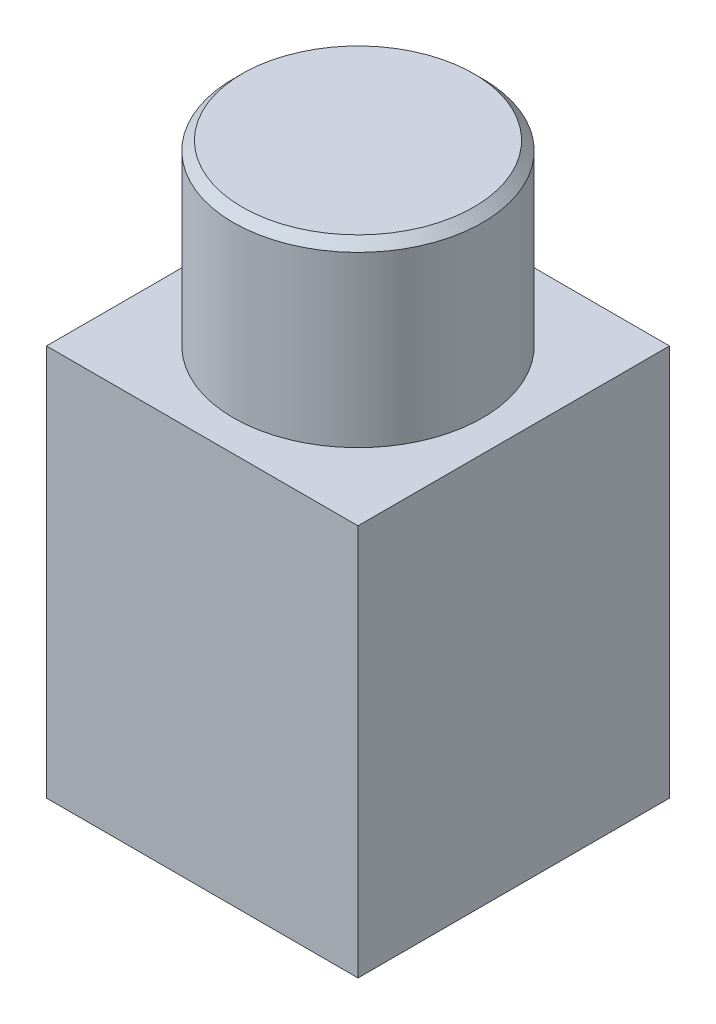
ISO-10303-21;
HEADER;
FILE_DESCRIPTION(('STEP AP214'),'2;1');
FILE_NAME('part.step','',(''),(''),'','','');
FILE_SCHEMA(('AUTOMOTIVE_DESIGN { 1 0 10303 214 1 1 1 1 }'));
ENDSEC;
DATA;
#1=APPLICATION_CONTEXT('core data for automotive mechanical design processes');
#2=APPLICATION_PROTOCOL_DEFINITION('international standard','automotive_design',2000,#1);
#3=PRODUCT_CONTEXT('',#1,'mechanical');
#4=PRODUCT('Part','Part','',(#3));
#5=PRODUCT_RELATED_PRODUCT_CATEGORY('part','',(#4));
#6=PRODUCT_DEFINITION_FORMATION('','',#4);
#7=PRODUCT_DEFINITION_CONTEXT('part definition',#1,'design');
#8=PRODUCT_DEFINITION('design','',#6,#7);
#9=PRODUCT_DEFINITION_SHAPE('','',#8);
#10=(LENGTH_UNIT() NAMED_UNIT(*) SI_UNIT(.MILLI.,.METRE.));
#11=(NAMED_UNIT(*) PLANE_ANGLE_UNIT() SI_UNIT($,.RADIAN.));
#12=(NAMED_UNIT(*) SI_UNIT($,.STERADIAN.) SOLID_ANGLE_UNIT());
#13=UNCERTAINTY_MEASURE_WITH_UNIT(LENGTH_MEASURE(1.E-05),#10,'distance_accuracy_value','');
#14=(GEOMETRIC_REPRESENTATION_CONTEXT(3) GLOBAL_UNCERTAINTY_ASSIGNED_CONTEXT((#13)) GLOBAL_UNIT_ASSIGNED_CONTEXT((#10,
#11,#12)) REPRESENTATION_CONTEXT('',''));
#15=CARTESIAN_POINT('',(0.,0.,0.));
#16=DIRECTION('',(0.,0.,1.));
#17=DIRECTION('',(1.,0.,0.));
#18=AXIS2_PLACEMENT_3D('',#15,#16,#17);
#19=CARTESIAN_POINT('',(0.,4.4,0.));
#20=DIRECTION('',(0.,-1.,0.));
#21=DIRECTION('',(0.,0.,-1.));
#22=AXIS2_PLACEMENT_3D('',#19,#20,#21);
#23=PLANE('',#22);
#24=CARTESIAN_POINT('',(0.,4.4,0.));
#25=DIRECTION('',(0.,-1.,0.));
#26=DIRECTION('',(0.,0.,-1.));
#27=AXIS2_PLACEMENT_3D('',#24,#25,#26);
#28=CIRCLE('',#27,1.4);
#29=CARTESIAN_POINT('',(0.,4.4,-1.4));
#30=VERTEX_POINT('',#29);
#31=EDGE_CURVE('E117',#30,#30,#28,.F.);
#32=ORIENTED_EDGE('',*,*,#31,.F.);
#33=EDGE_LOOP('',(#32));
#34=FACE_BOUND('',#33,.T.);
#35=DIRECTION('',(0.,0.,-1.));
#36=VECTOR('',#35,1.);
#37=CARTESIAN_POINT('',(-1.75,4.4,-1.75));
#38=LINE('',#37,#36);
#39=CARTESIAN_POINT('',(-1.75,4.4,1.75));
#40=VERTEX_POINT('',#39);
#41=CARTESIAN_POINT('',(-1.75,4.4,-1.75));
#42=VERTEX_POINT('',#41);
#43=EDGE_CURVE('E96',#40,#42,#38,.T.);
#44=ORIENTED_EDGE('',*,*,#43,.F.);
#45=DIRECTION('',(-1.,0.,0.));
#46=VECTOR('',#45,1.);
#47=CARTESIAN_POINT('',(1.75,4.4,1.75));
#48=LINE('',#47,#46);
#49=CARTESIAN_POINT('',(1.75,4.4,1.75));
#50=VERTEX_POINT('',#49);
#51=EDGE_CURVE('E93',#50,#40,#48,.T.);
#52=ORIENTED_EDGE('',*,*,#51,.F.);
#53=DIRECTION('',(0.,0.,1.));
#54=VECTOR('',#53,1.);
#55=CARTESIAN_POINT('',(1.75,4.4,-1.75));
#56=LINE('',#55,#54);
#57=CARTESIAN_POINT('',(1.75,4.4,-1.75));
#58=VERTEX_POINT('',#57);
#59=EDGE_CURVE('E86',#58,#50,#56,.T.);
#60=ORIENTED_EDGE('',*,*,#59,.F.);
#61=DIRECTION('',(1.,0.,0.));
#62=VECTOR('',#61,1.);
#63=CARTESIAN_POINT('',(1.75,4.4,-1.75));
#64=LINE('',#63,#62);
#65=EDGE_CURVE('E92',#42,#58,#64,.T.);
#66=ORIENTED_EDGE('',*,*,#65,.F.);
#67=EDGE_LOOP('',(#44,#52,#60,#66));
#68=FACE_BOUND('',#67,.T.);
#69=ADVANCED_FACE('F35',(#34,#68),#23,.F.);
#70=CARTESIAN_POINT('',(0.,6.4,0.));
#71=DIRECTION('',(0.,-1.,0.));
#72=DIRECTION('',(0.,0.,-1.));
#73=AXIS2_PLACEMENT_3D('',#70,#71,#72);
#74=CYLINDRICAL_SURFACE('',#73,1.4);
#75=CARTESIAN_POINT('',(0.,6.3,0.));
#76=DIRECTION('',(0.,1.,0.));
#77=DIRECTION('',(0.,0.,1.));
#78=AXIS2_PLACEMENT_3D('',#75,#76,#77);
#79=CIRCLE('',#78,1.4);
#80=CARTESIAN_POINT('',(0.,6.3,1.4));
#81=VERTEX_POINT('',#80);
#82=EDGE_CURVE('E11',#81,#81,#79,.F.);
#83=ORIENTED_EDGE('',*,*,#82,.T.);
#84=EDGE_LOOP('',(#83));
#85=FACE_BOUND('',#84,.T.);
#86=ORIENTED_EDGE('',*,*,#31,.T.);
#87=EDGE_LOOP('',(#86));
#88=FACE_BOUND('',#87,.T.);
#89=ADVANCED_FACE('F135',(#85,#88),#74,.T.);
#90=CARTESIAN_POINT('',(0.,6.4,0.));
#91=DIRECTION('',(0.,1.,0.));
#92=DIRECTION('',(0.,0.,1.));
#93=AXIS2_PLACEMENT_3D('',#90,#91,#92);
#94=PLANE('',#93);
#95=CARTESIAN_POINT('',(0.,6.4,0.));
#96=DIRECTION('',(0.,1.,0.));
#97=DIRECTION('',(0.,0.,1.));
#98=AXIS2_PLACEMENT_3D('',#95,#96,#97);
#99=CIRCLE('',#98,1.3);
#100=CARTESIAN_POINT('',(0.,6.4,1.3));
#101=VERTEX_POINT('',#100);
#102=EDGE_CURVE('E44',#101,#101,#99,.T.);
#103=ORIENTED_EDGE('',*,*,#102,.T.);
#104=EDGE_LOOP('',(#103));
#105=FACE_BOUND('',#104,.T.);
#106=ADVANCED_FACE('F124',(#105),#94,.T.);
#107=CARTESIAN_POINT('',(0.,6.4,0.));
#108=DIRECTION('',(0.,-1.,0.));
#109=DIRECTION('',(0.,0.,-1.));
#110=AXIS2_PLACEMENT_3D('',#107,#108,#109);
#111=CONICAL_SURFACE('',#110,1.3,0.785398163397444);
#112=ORIENTED_EDGE('',*,*,#82,.F.);
#113=EDGE_LOOP('',(#112));
#114=FACE_BOUND('',#113,.T.);
#115=ORIENTED_EDGE('',*,*,#102,.F.);
#116=EDGE_LOOP('',(#115));
#117=FACE_BOUND('',#116,.T.);
#118=ADVANCED_FACE('F37',(#114,#117),#111,.T.);
#119=CARTESIAN_POINT('',(-1.75,4.4,-1.75));
#120=DIRECTION('',(-1.,0.,0.));
#121=DIRECTION('',(0.,0.,1.));
#122=AXIS2_PLACEMENT_3D('',#119,#120,#121);
#123=PLANE('',#122);
#124=DIRECTION('',(0.,0.,-1.));
#125=VECTOR('',#124,1.);
#126=CARTESIAN_POINT('',(-1.75,0.,-1.75));
#127=LINE('',#126,#125);
#128=CARTESIAN_POINT('',(-1.75,0.,1.75));
#129=VERTEX_POINT('',#128);
#130=CARTESIAN_POINT('',(-1.75,0.,-1.75));
#131=VERTEX_POINT('',#130);
#132=EDGE_CURVE('E102',#129,#131,#127,.T.);
#133=ORIENTED_EDGE('',*,*,#132,.F.);
#134=DIRECTION('',(0.,-1.,0.));
#135=VECTOR('',#134,1.);
#136=CARTESIAN_POINT('',(-1.75,4.4,1.75));
#137=LINE('',#136,#135);
#138=EDGE_CURVE('E52',#40,#129,#137,.T.);
#139=ORIENTED_EDGE('',*,*,#138,.F.);
#140=ORIENTED_EDGE('',*,*,#43,.T.);
#141=DIRECTION('',(0.,-1.,0.));
#142=VECTOR('',#141,1.);
#143=CARTESIAN_POINT('',(-1.75,4.4,-1.75));
#144=LINE('',#143,#142);
#145=EDGE_CURVE('E80',#42,#131,#144,.T.);
#146=ORIENTED_EDGE('',*,*,#145,.T.);
#147=EDGE_LOOP('',(#133,#139,#140,#146));
#148=FACE_BOUND('',#147,.T.);
#149=ADVANCED_FACE('F127',(#148),#123,.T.);
#150=CARTESIAN_POINT('',(1.75,4.4,1.75));
#151=DIRECTION('',(0.,0.,1.));
#152=DIRECTION('',(1.,0.,0.));
#153=AXIS2_PLACEMENT_3D('',#150,#151,#152);
#154=PLANE('',#153);
#155=DIRECTION('',(-1.,0.,0.));
#156=VECTOR('',#155,1.);
#157=CARTESIAN_POINT('',(1.75,0.,1.75));
#158=LINE('',#157,#156);
#159=CARTESIAN_POINT('',(1.75,0.,1.75));
#160=VERTEX_POINT('',#159);
#161=EDGE_CURVE('E98',#160,#129,#158,.T.);
#162=ORIENTED_EDGE('',*,*,#161,.F.);
#163=DIRECTION('',(0.,-1.,0.));
#164=VECTOR('',#163,1.);
#165=CARTESIAN_POINT('',(1.75,4.4,1.75));
#166=LINE('',#165,#164);
#167=EDGE_CURVE('E69',#50,#160,#166,.T.);
#168=ORIENTED_EDGE('',*,*,#167,.F.);
#169=ORIENTED_EDGE('',*,*,#51,.T.);
#170=ORIENTED_EDGE('',*,*,#138,.T.);
#171=EDGE_LOOP('',(#162,#168,#169,#170));
#172=FACE_BOUND('',#171,.T.);
#173=ADVANCED_FACE('F133',(#172),#154,.T.);
#174=CARTESIAN_POINT('',(1.75,4.4,-1.75));
#175=DIRECTION('',(1.,0.,0.));
#176=DIRECTION('',(0.,0.,-1.));
#177=AXIS2_PLACEMENT_3D('',#174,#175,#176);
#178=PLANE('',#177);
#179=DIRECTION('',(0.,0.,1.));
#180=VECTOR('',#179,1.);
#181=CARTESIAN_POINT('',(1.75,0.,-1.75));
#182=LINE('',#181,#180);
#183=CARTESIAN_POINT('',(1.75,0.,-1.75));
#184=VERTEX_POINT('',#183);
#185=EDGE_CURVE('E88',#184,#160,#182,.T.);
#186=ORIENTED_EDGE('',*,*,#185,.F.);
#187=DIRECTION('',(0.,-1.,0.));
#188=VECTOR('',#187,1.);
#189=CARTESIAN_POINT('',(1.75,4.4,-1.75));
#190=LINE('',#189,#188);
#191=EDGE_CURVE('E83',#58,#184,#190,.T.);
#192=ORIENTED_EDGE('',*,*,#191,.F.);
#193=ORIENTED_EDGE('',*,*,#59,.T.);
#194=ORIENTED_EDGE('',*,*,#167,.T.);
#195=EDGE_LOOP('',(#186,#192,#193,#194));
#196=FACE_BOUND('',#195,.T.);
#197=ADVANCED_FACE('F85',(#196),#178,.T.);
#198=CARTESIAN_POINT('',(1.75,4.4,-1.75));
#199=DIRECTION('',(0.,0.,-1.));
#200=DIRECTION('',(-1.,0.,0.));
#201=AXIS2_PLACEMENT_3D('',#198,#199,#200);
#202=PLANE('',#201);
#203=DIRECTION('',(1.,0.,0.));
#204=VECTOR('',#203,1.);
#205=CARTESIAN_POINT('',(1.75,0.,-1.75));
#206=LINE('',#205,#204);
#207=EDGE_CURVE('E105',#131,#184,#206,.T.);
#208=ORIENTED_EDGE('',*,*,#207,.F.);
#209=ORIENTED_EDGE('',*,*,#145,.F.);
#210=ORIENTED_EDGE('',*,*,#65,.T.);
#211=ORIENTED_EDGE('',*,*,#191,.T.);
#212=EDGE_LOOP('',(#208,#209,#210,#211));
#213=FACE_BOUND('',#212,.T.);
#214=ADVANCED_FACE('F95',(#213),#202,.T.);
#215=CARTESIAN_POINT('',(0.,0.2,0.));
#216=DIRECTION('',(0.,-1.,0.));
#217=DIRECTION('',(0.,0.,-1.));
#218=AXIS2_PLACEMENT_3D('',#215,#216,#217);
#219=PLANE('',#218);
#220=CARTESIAN_POINT('',(0.,0.2,0.));
#221=DIRECTION('',(0.,-1.,0.));
#222=DIRECTION('',(0.,0.,-1.));
#223=AXIS2_PLACEMENT_3D('',#220,#221,#222);
#224=CIRCLE('',#223,1.1);
#225=CARTESIAN_POINT('',(0.,0.2,-1.1));
#226=VERTEX_POINT('',#225);
#227=EDGE_CURVE('E114',#226,#226,#224,.T.);
#228=ORIENTED_EDGE('',*,*,#227,.T.);
#229=EDGE_LOOP('',(#228));
#230=FACE_BOUND('',#229,.T.);
#231=ADVANCED_FACE('F154',(#230),#219,.T.);
#232=CARTESIAN_POINT('',(0.,0.2,0.));
#233=DIRECTION('',(0.,-1.,0.));
#234=DIRECTION('',(0.,0.,-1.));
#235=AXIS2_PLACEMENT_3D('',#232,#233,#234);
#236=CYLINDRICAL_SURFACE('',#235,1.1);
#237=ORIENTED_EDGE('',*,*,#227,.F.);
#238=EDGE_LOOP('',(#237));
#239=FACE_BOUND('',#238,.T.);
#240=CARTESIAN_POINT('',(0.,0.,0.));
#241=DIRECTION('',(0.,-1.,0.));
#242=DIRECTION('',(0.,0.,-1.));
#243=AXIS2_PLACEMENT_3D('',#240,#241,#242);
#244=CIRCLE('',#243,1.1);
#245=CARTESIAN_POINT('',(0.,0.,-1.1));
#246=VERTEX_POINT('',#245);
#247=EDGE_CURVE('E111',#246,#246,#244,.T.);
#248=ORIENTED_EDGE('',*,*,#247,.T.);
#249=EDGE_LOOP('',(#248));
#250=FACE_BOUND('',#249,.T.);
#251=ADVANCED_FACE('F149',(#239,#250),#236,.F.);
#252=CARTESIAN_POINT('',(0.,0.,0.));
#253=DIRECTION('',(0.,-1.,0.));
#254=DIRECTION('',(0.,0.,-1.));
#255=AXIS2_PLACEMENT_3D('',#252,#253,#254);
#256=PLANE('',#255);
#257=ORIENTED_EDGE('',*,*,#247,.F.);
#258=EDGE_LOOP('',(#257));
#259=FACE_BOUND('',#258,.T.);
#260=ORIENTED_EDGE('',*,*,#132,.T.);
#261=ORIENTED_EDGE('',*,*,#207,.T.);
#262=ORIENTED_EDGE('',*,*,#185,.T.);
#263=ORIENTED_EDGE('',*,*,#161,.T.);
#264=EDGE_LOOP('',(#260,#261,#262,#263));
#265=FACE_BOUND('',#264,.T.);
#266=ADVANCED_FACE('F147',(#259,#265),#256,.T.);
#267=CLOSED_SHELL('',(#69,#89,#106,#118,#149,#173,#197,#214,#231,#251,#266));
#268=MANIFOLD_SOLID_BREP('B2',#267);
#269=ADVANCED_BREP_SHAPE_REPRESENTATION('',(#18,#268),#14);
#270=SHAPE_DEFINITION_REPRESENTATION(#9,#269);
ENDSEC;
END-ISO-10303-21;
